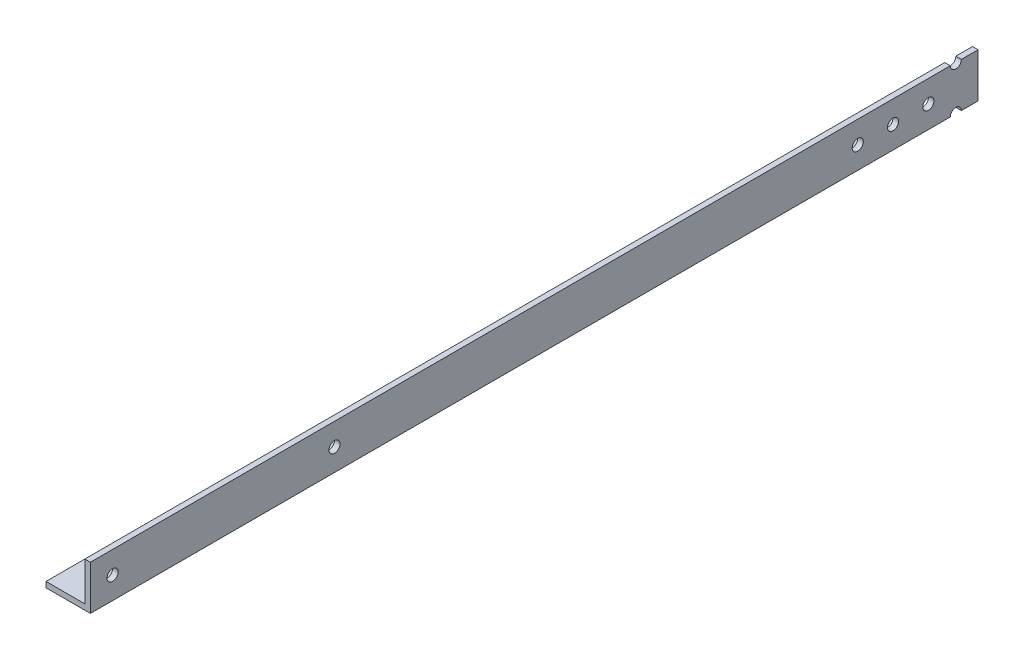
ISO-10303-21;
HEADER;
FILE_DESCRIPTION(('STEP AP214'),'2;1');
FILE_NAME('part.step','',(''),(''),'','','');
FILE_SCHEMA(('AUTOMOTIVE_DESIGN { 1 0 10303 214 1 1 1 1 }'));
ENDSEC;
DATA;
#1=APPLICATION_CONTEXT('core data for automotive mechanical design processes');
#2=APPLICATION_PROTOCOL_DEFINITION('international standard','automotive_design',2000,#1);
#3=PRODUCT_CONTEXT('',#1,'mechanical');
#4=PRODUCT('Part','Part','',(#3));
#5=PRODUCT_RELATED_PRODUCT_CATEGORY('part','',(#4));
#6=PRODUCT_DEFINITION_FORMATION('','',#4);
#7=PRODUCT_DEFINITION_CONTEXT('part definition',#1,'design');
#8=PRODUCT_DEFINITION('design','',#6,#7);
#9=PRODUCT_DEFINITION_SHAPE('','',#8);
#10=(LENGTH_UNIT() NAMED_UNIT(*) SI_UNIT(.MILLI.,.METRE.));
#11=(NAMED_UNIT(*) PLANE_ANGLE_UNIT() SI_UNIT($,.RADIAN.));
#12=(NAMED_UNIT(*) SI_UNIT($,.STERADIAN.) SOLID_ANGLE_UNIT());
#13=UNCERTAINTY_MEASURE_WITH_UNIT(LENGTH_MEASURE(1.E-05),#10,'distance_accuracy_value','');
#14=(GEOMETRIC_REPRESENTATION_CONTEXT(3) GLOBAL_UNCERTAINTY_ASSIGNED_CONTEXT((#13)) GLOBAL_UNIT_ASSIGNED_CONTEXT((#10,
#11,#12)) REPRESENTATION_CONTEXT('',''));
#15=CARTESIAN_POINT('',(0.,0.,0.));
#16=DIRECTION('',(0.,0.,1.));
#17=DIRECTION('',(1.,0.,0.));
#18=AXIS2_PLACEMENT_3D('',#15,#16,#17);
#19=CARTESIAN_POINT('',(-12.7,0.,254.));
#20=DIRECTION('',(0.,1.,0.));
#21=DIRECTION('',(0.,0.,1.));
#22=AXIS2_PLACEMENT_3D('',#19,#20,#21);
#23=PLANE('',#22);
#24=DIRECTION('',(0.,0.,1.));
#25=VECTOR('',#24,1.);
#26=CARTESIAN_POINT('',(-1.5875,0.,0.));
#27=LINE('',#26,#25);
#28=CARTESIAN_POINT('',(-1.5875,0.,7.93749999999999));
#29=VERTEX_POINT('',#28);
#30=CARTESIAN_POINT('',(-1.5875,0.,12.7));
#31=VERTEX_POINT('',#30);
#32=EDGE_CURVE('E130',#29,#31,#27,.T.);
#33=ORIENTED_EDGE('',*,*,#32,.F.);
#34=DIRECTION('',(1.,0.,0.));
#35=VECTOR('',#34,1.);
#36=CARTESIAN_POINT('',(-6.07762806053458,0.,7.93749999999999));
#37=LINE('',#36,#35);
#38=CARTESIAN_POINT('',(0.,0.,7.93749999999999));
#39=VERTEX_POINT('',#38);
#40=EDGE_CURVE('E46',#29,#39,#37,.T.);
#41=ORIENTED_EDGE('',*,*,#40,.T.);
#42=DIRECTION('',(0.,0.,-1.));
#43=VECTOR('',#42,1.);
#44=CARTESIAN_POINT('',(0.,0.,254.));
#45=LINE('',#44,#43);
#46=CARTESIAN_POINT('',(0.,0.,254.));
#47=VERTEX_POINT('',#46);
#48=EDGE_CURVE('E39',#47,#39,#45,.T.);
#49=ORIENTED_EDGE('',*,*,#48,.F.);
#50=DIRECTION('',(1.,0.,0.));
#51=VECTOR('',#50,1.);
#52=CARTESIAN_POINT('',(-12.7,0.,254.));
#53=LINE('',#52,#51);
#54=CARTESIAN_POINT('',(-12.7,0.,254.));
#55=VERTEX_POINT('',#54);
#56=EDGE_CURVE('E164',#55,#47,#53,.T.);
#57=ORIENTED_EDGE('',*,*,#56,.F.);
#58=DIRECTION('',(0.,0.,-1.));
#59=VECTOR('',#58,1.);
#60=CARTESIAN_POINT('',(-12.7,0.,254.));
#61=LINE('',#60,#59);
#62=CARTESIAN_POINT('',(-12.7,0.,12.7));
#63=VERTEX_POINT('',#62);
#64=EDGE_CURVE('E177',#55,#63,#61,.T.);
#65=ORIENTED_EDGE('',*,*,#64,.T.);
#66=DIRECTION('',(-1.,0.,0.));
#67=VECTOR('',#66,1.);
#68=CARTESIAN_POINT('',(-12.7,0.,12.7));
#69=LINE('',#68,#67);
#70=EDGE_CURVE('E129',#31,#63,#69,.T.);
#71=ORIENTED_EDGE('',*,*,#70,.F.);
#72=EDGE_LOOP('',(#33,#41,#49,#57,#65,#71));
#73=FACE_BOUND('',#72,.T.);
#74=ADVANCED_FACE('F31',(#73),#23,.F.);
#75=CARTESIAN_POINT('',(0.,12.7,254.));
#76=DIRECTION('',(0.,-1.,0.));
#77=DIRECTION('',(0.,0.,-1.));
#78=AXIS2_PLACEMENT_3D('',#75,#76,#77);
#79=PLANE('',#78);
#80=DIRECTION('',(0.,0.,-1.));
#81=VECTOR('',#80,1.);
#82=CARTESIAN_POINT('',(-1.5875,12.7,254.));
#83=LINE('',#82,#81);
#84=CARTESIAN_POINT('',(-1.5875,12.7,4.76249999999999));
#85=VERTEX_POINT('',#84);
#86=CARTESIAN_POINT('',(-1.5875,12.7,0.));
#87=VERTEX_POINT('',#86);
#88=EDGE_CURVE('E194',#85,#87,#83,.T.);
#89=ORIENTED_EDGE('',*,*,#88,.F.);
#90=DIRECTION('',(1.,0.,0.));
#91=VECTOR('',#90,1.);
#92=CARTESIAN_POINT('',(-6.07762806053458,12.7,4.76249999999999));
#93=LINE('',#92,#91);
#94=CARTESIAN_POINT('',(0.,12.7,4.76249999999999));
#95=VERTEX_POINT('',#94);
#96=EDGE_CURVE('E53',#85,#95,#93,.T.);
#97=ORIENTED_EDGE('',*,*,#96,.T.);
#98=DIRECTION('',(0.,0.,-1.));
#99=VECTOR('',#98,1.);
#100=CARTESIAN_POINT('',(0.,12.7,254.));
#101=LINE('',#100,#99);
#102=CARTESIAN_POINT('',(0.,12.7,0.));
#103=VERTEX_POINT('',#102);
#104=EDGE_CURVE('E198',#95,#103,#101,.T.);
#105=ORIENTED_EDGE('',*,*,#104,.T.);
#106=DIRECTION('',(-1.,0.,0.));
#107=VECTOR('',#106,1.);
#108=CARTESIAN_POINT('',(0.,12.7,0.));
#109=LINE('',#108,#107);
#110=EDGE_CURVE('E182',#103,#87,#109,.T.);
#111=ORIENTED_EDGE('',*,*,#110,.T.);
#112=EDGE_LOOP('',(#89,#97,#105,#111));
#113=FACE_BOUND('',#112,.T.);
#114=ADVANCED_FACE('F227',(#113),#79,.F.);
#115=CARTESIAN_POINT('',(0.,0.,4.76249999999999));
#116=VERTEX_POINT('',#115);
#117=CARTESIAN_POINT('',(0.,0.,0.));
#118=VERTEX_POINT('',#117);
#119=EDGE_CURVE('E123',#116,#118,#45,.T.);
#120=ORIENTED_EDGE('',*,*,#119,.F.);
#121=DIRECTION('',(1.,0.,0.));
#122=VECTOR('',#121,1.);
#123=CARTESIAN_POINT('',(-6.07762806053458,0.,4.76249999999999));
#124=LINE('',#123,#122);
#125=CARTESIAN_POINT('',(-1.5875,0.,4.76249999999999));
#126=VERTEX_POINT('',#125);
#127=EDGE_CURVE('E112',#116,#126,#124,.F.);
#128=ORIENTED_EDGE('',*,*,#127,.T.);
#129=CARTESIAN_POINT('',(-1.5875,0.,0.));
#130=VERTEX_POINT('',#129);
#131=EDGE_CURVE('E121',#130,#126,#27,.T.);
#132=ORIENTED_EDGE('',*,*,#131,.F.);
#133=DIRECTION('',(1.,0.,0.));
#134=VECTOR('',#133,1.);
#135=CARTESIAN_POINT('',(-12.7,0.,0.));
#136=LINE('',#135,#134);
#137=EDGE_CURVE('E163',#130,#118,#136,.T.);
#138=ORIENTED_EDGE('',*,*,#137,.T.);
#139=EDGE_LOOP('',(#120,#128,#132,#138));
#140=FACE_BOUND('',#139,.T.);
#141=ADVANCED_FACE('F33',(#140),#23,.F.);
#142=CARTESIAN_POINT('',(0.,0.,254.));
#143=DIRECTION('',(-1.,0.,0.));
#144=DIRECTION('',(0.,0.,1.));
#145=AXIS2_PLACEMENT_3D('',#142,#143,#144);
#146=PLANE('',#145);
#147=CARTESIAN_POINT('',(0.,6.35,34.4133003783411));
#148=DIRECTION('',(1.,0.,0.));
#149=DIRECTION('',(0.,0.,-1.));
#150=AXIS2_PLACEMENT_3D('',#147,#148,#149);
#151=CIRCLE('',#150,1.5875);
#152=CARTESIAN_POINT('',(0.,6.35,32.8258003783411));
#153=VERTEX_POINT('',#152);
#154=EDGE_CURVE('E327',#153,#153,#151,.T.);
#155=ORIENTED_EDGE('',*,*,#154,.F.);
#156=EDGE_LOOP('',(#155));
#157=FACE_BOUND('',#156,.T.);
#158=CARTESIAN_POINT('',(0.,6.35,24.3105122421383));
#159=DIRECTION('',(1.,0.,0.));
#160=DIRECTION('',(0.,0.,-1.));
#161=AXIS2_PLACEMENT_3D('',#158,#159,#160);
#162=CIRCLE('',#161,1.5875);
#163=CARTESIAN_POINT('',(0.,6.35,22.7230122421383));
#164=VERTEX_POINT('',#163);
#165=EDGE_CURVE('E132',#164,#164,#162,.T.);
#166=ORIENTED_EDGE('',*,*,#165,.F.);
#167=EDGE_LOOP('',(#166));
#168=FACE_BOUND('',#167,.T.);
#169=CARTESIAN_POINT('',(0.,6.35,14.2077241059355));
#170=DIRECTION('',(1.,0.,0.));
#171=DIRECTION('',(0.,0.,-1.));
#172=AXIS2_PLACEMENT_3D('',#169,#170,#171);
#173=CIRCLE('',#172,1.5875);
#174=CARTESIAN_POINT('',(0.,6.35,12.6202241059355));
#175=VERTEX_POINT('',#174);
#176=EDGE_CURVE('E147',#175,#175,#173,.T.);
#177=ORIENTED_EDGE('',*,*,#176,.F.);
#178=EDGE_LOOP('',(#177));
#179=FACE_BOUND('',#178,.T.);
#180=CARTESIAN_POINT('',(0.,6.35,184.15));
#181=DIRECTION('',(1.,0.,0.));
#182=DIRECTION('',(0.,0.,-1.));
#183=AXIS2_PLACEMENT_3D('',#180,#181,#182);
#184=CIRCLE('',#183,1.58750000000004);
#185=CARTESIAN_POINT('',(0.,6.35,182.5625));
#186=VERTEX_POINT('',#185);
#187=EDGE_CURVE('E151',#186,#186,#184,.T.);
#188=ORIENTED_EDGE('',*,*,#187,.F.);
#189=EDGE_LOOP('',(#188));
#190=FACE_BOUND('',#189,.T.);
#191=CARTESIAN_POINT('',(0.,6.35,247.65));
#192=DIRECTION('',(1.,0.,0.));
#193=DIRECTION('',(0.,0.,-1.));
#194=AXIS2_PLACEMENT_3D('',#191,#192,#193);
#195=CIRCLE('',#194,1.58750000000004);
#196=CARTESIAN_POINT('',(0.,6.35,246.0625));
#197=VERTEX_POINT('',#196);
#198=EDGE_CURVE('E157',#197,#197,#195,.T.);
#199=ORIENTED_EDGE('',*,*,#198,.F.);
#200=EDGE_LOOP('',(#199));
#201=FACE_BOUND('',#200,.T.);
#202=ORIENTED_EDGE('',*,*,#48,.T.);
#203=CARTESIAN_POINT('',(0.,0.,6.34999999999999));
#204=DIRECTION('',(1.,0.,0.));
#205=DIRECTION('',(0.,0.,-1.));
#206=AXIS2_PLACEMENT_3D('',#203,#204,#205);
#207=CIRCLE('',#206,1.5875);
#208=EDGE_CURVE('E124',#116,#39,#207,.T.);
#209=ORIENTED_EDGE('',*,*,#208,.F.);
#210=ORIENTED_EDGE('',*,*,#119,.T.);
#211=DIRECTION('',(0.,1.,0.));
#212=VECTOR('',#211,1.);
#213=CARTESIAN_POINT('',(0.,0.,0.));
#214=LINE('',#213,#212);
#215=EDGE_CURVE('E179',#118,#103,#214,.T.);
#216=ORIENTED_EDGE('',*,*,#215,.T.);
#217=ORIENTED_EDGE('',*,*,#104,.F.);
#218=CARTESIAN_POINT('',(0.,12.7,6.34999999999999));
#219=DIRECTION('',(1.,0.,0.));
#220=DIRECTION('',(0.,0.,-1.));
#221=AXIS2_PLACEMENT_3D('',#218,#219,#220);
#222=CIRCLE('',#221,1.5875);
#223=CARTESIAN_POINT('',(0.,12.7,7.93749999999999));
#224=VERTEX_POINT('',#223);
#225=EDGE_CURVE('E286',#224,#95,#222,.T.);
#226=ORIENTED_EDGE('',*,*,#225,.F.);
#227=CARTESIAN_POINT('',(0.,12.7,254.));
#228=VERTEX_POINT('',#227);
#229=EDGE_CURVE('E199',#228,#224,#101,.T.);
#230=ORIENTED_EDGE('',*,*,#229,.F.);
#231=DIRECTION('',(0.,1.,0.));
#232=VECTOR('',#231,1.);
#233=CARTESIAN_POINT('',(0.,0.,254.));
#234=LINE('',#233,#232);
#235=EDGE_CURVE('E167',#47,#228,#234,.T.);
#236=ORIENTED_EDGE('',*,*,#235,.F.);
#237=EDGE_LOOP('',(#202,#209,#210,#216,#217,#226,#230,#236));
#238=FACE_BOUND('',#237,.T.);
#239=ADVANCED_FACE('F236',(#157,#168,#179,#190,#201,#238),#146,.F.);
#240=ORIENTED_EDGE('',*,*,#229,.T.);
#241=DIRECTION('',(1.,0.,0.));
#242=VECTOR('',#241,1.);
#243=CARTESIAN_POINT('',(-6.07762806053458,12.7,7.93749999999999));
#244=LINE('',#243,#242);
#245=CARTESIAN_POINT('',(-1.5875,12.7,7.93749999999999));
#246=VERTEX_POINT('',#245);
#247=EDGE_CURVE('E292',#224,#246,#244,.F.);
#248=ORIENTED_EDGE('',*,*,#247,.T.);
#249=CARTESIAN_POINT('',(-1.5875,12.7,254.));
#250=VERTEX_POINT('',#249);
#251=EDGE_CURVE('E195',#250,#246,#83,.T.);
#252=ORIENTED_EDGE('',*,*,#251,.F.);
#253=DIRECTION('',(-1.,0.,0.));
#254=VECTOR('',#253,1.);
#255=CARTESIAN_POINT('',(0.,12.7,254.));
#256=LINE('',#255,#254);
#257=EDGE_CURVE('E169',#228,#250,#256,.T.);
#258=ORIENTED_EDGE('',*,*,#257,.F.);
#259=EDGE_LOOP('',(#240,#248,#252,#258));
#260=FACE_BOUND('',#259,.T.);
#261=ADVANCED_FACE('F234',(#260),#79,.F.);
#262=CARTESIAN_POINT('',(-1.5875,12.7,254.));
#263=DIRECTION('',(1.,0.,0.));
#264=DIRECTION('',(0.,1.,0.));
#265=AXIS2_PLACEMENT_3D('',#262,#263,#264);
#266=PLANE('',#265);
#267=CARTESIAN_POINT('',(-1.5875,6.35,34.4133003783411));
#268=DIRECTION('',(1.,0.,0.));
#269=DIRECTION('',(0.,1.,0.));
#270=AXIS2_PLACEMENT_3D('',#267,#268,#269);
#271=CIRCLE('',#270,1.5875);
#272=CARTESIAN_POINT('',(-1.5875,6.35,32.8258003783411));
#273=VERTEX_POINT('',#272);
#274=EDGE_CURVE('E325',#273,#273,#271,.F.);
#275=ORIENTED_EDGE('',*,*,#274,.F.);
#276=EDGE_LOOP('',(#275));
#277=FACE_BOUND('',#276,.T.);
#278=CARTESIAN_POINT('',(-1.5875,6.35,24.3105122421383));
#279=DIRECTION('',(1.,0.,0.));
#280=DIRECTION('',(0.,1.,0.));
#281=AXIS2_PLACEMENT_3D('',#278,#279,#280);
#282=CIRCLE('',#281,1.5875);
#283=CARTESIAN_POINT('',(-1.5875,7.9375,24.3105122421383));
#284=VERTEX_POINT('',#283);
#285=EDGE_CURVE('E146',#284,#284,#282,.T.);
#286=ORIENTED_EDGE('',*,*,#285,.T.);
#287=EDGE_LOOP('',(#286));
#288=FACE_BOUND('',#287,.T.);
#289=CARTESIAN_POINT('',(-1.5875,6.35,14.2077241059355));
#290=DIRECTION('',(1.,0.,0.));
#291=DIRECTION('',(0.,1.,0.));
#292=AXIS2_PLACEMENT_3D('',#289,#290,#291);
#293=CIRCLE('',#292,1.5875);
#294=CARTESIAN_POINT('',(-1.5875,7.9375,14.2077241059355));
#295=VERTEX_POINT('',#294);
#296=EDGE_CURVE('E150',#295,#295,#293,.T.);
#297=ORIENTED_EDGE('',*,*,#296,.T.);
#298=EDGE_LOOP('',(#297));
#299=FACE_BOUND('',#298,.T.);
#300=CARTESIAN_POINT('',(-1.5875,6.35,184.15));
#301=DIRECTION('',(1.,0.,0.));
#302=DIRECTION('',(0.,1.,0.));
#303=AXIS2_PLACEMENT_3D('',#300,#301,#302);
#304=CIRCLE('',#303,1.58750000000004);
#305=CARTESIAN_POINT('',(-1.5875,6.35,182.5625));
#306=VERTEX_POINT('',#305);
#307=EDGE_CURVE('E154',#306,#306,#304,.F.);
#308=ORIENTED_EDGE('',*,*,#307,.F.);
#309=EDGE_LOOP('',(#308));
#310=FACE_BOUND('',#309,.T.);
#311=CARTESIAN_POINT('',(-1.5875,6.35,247.65));
#312=DIRECTION('',(1.,0.,0.));
#313=DIRECTION('',(0.,1.,0.));
#314=AXIS2_PLACEMENT_3D('',#311,#312,#313);
#315=CIRCLE('',#314,1.58750000000004);
#316=CARTESIAN_POINT('',(-1.5875,6.35,246.0625));
#317=VERTEX_POINT('',#316);
#318=EDGE_CURVE('E160',#317,#317,#315,.F.);
#319=ORIENTED_EDGE('',*,*,#318,.F.);
#320=EDGE_LOOP('',(#319));
#321=FACE_BOUND('',#320,.T.);
#322=ORIENTED_EDGE('',*,*,#131,.T.);
#323=CARTESIAN_POINT('',(-1.5875,0.,6.34999999999999));
#324=DIRECTION('',(1.,0.,0.));
#325=DIRECTION('',(0.,1.,0.));
#326=AXIS2_PLACEMENT_3D('',#323,#324,#325);
#327=CIRCLE('',#326,1.5875);
#328=EDGE_CURVE('E11',#126,#29,#327,.T.);
#329=ORIENTED_EDGE('',*,*,#328,.T.);
#330=ORIENTED_EDGE('',*,*,#32,.T.);
#331=DIRECTION('',(0.,1.,0.));
#332=VECTOR('',#331,1.);
#333=CARTESIAN_POINT('',(-1.5875,-16.8753564777163,12.7));
#334=LINE('',#333,#332);
#335=CARTESIAN_POINT('',(-1.5875,1.5875,12.7));
#336=VERTEX_POINT('',#335);
#337=EDGE_CURVE('E134',#31,#336,#334,.T.);
#338=ORIENTED_EDGE('',*,*,#337,.T.);
#339=DIRECTION('',(0.,0.,-1.));
#340=VECTOR('',#339,1.);
#341=CARTESIAN_POINT('',(-1.5875,1.5875,254.));
#342=LINE('',#341,#340);
#343=CARTESIAN_POINT('',(-1.5875,1.5875,254.));
#344=VERTEX_POINT('',#343);
#345=EDGE_CURVE('E191',#344,#336,#342,.T.);
#346=ORIENTED_EDGE('',*,*,#345,.F.);
#347=DIRECTION('',(0.,-1.,0.));
#348=VECTOR('',#347,1.);
#349=CARTESIAN_POINT('',(-1.5875,12.7,254.));
#350=LINE('',#349,#348);
#351=EDGE_CURVE('E171',#250,#344,#350,.T.);
#352=ORIENTED_EDGE('',*,*,#351,.F.);
#353=ORIENTED_EDGE('',*,*,#251,.T.);
#354=CARTESIAN_POINT('',(-1.5875,12.7,6.34999999999999));
#355=DIRECTION('',(1.,0.,0.));
#356=DIRECTION('',(0.,1.,0.));
#357=AXIS2_PLACEMENT_3D('',#354,#355,#356);
#358=CIRCLE('',#357,1.5875);
#359=EDGE_CURVE('E288',#85,#246,#358,.F.);
#360=ORIENTED_EDGE('',*,*,#359,.F.);
#361=ORIENTED_EDGE('',*,*,#88,.T.);
#362=DIRECTION('',(0.,-1.,0.));
#363=VECTOR('',#362,1.);
#364=CARTESIAN_POINT('',(-1.5875,12.7,0.));
#365=LINE('',#364,#363);
#366=EDGE_CURVE('E128',#87,#130,#365,.T.);
#367=ORIENTED_EDGE('',*,*,#366,.T.);
#368=EDGE_LOOP('',(#322,#329,#330,#338,#346,#352,#353,#360,#361,#367));
#369=FACE_BOUND('',#368,.T.);
#370=ADVANCED_FACE('F126',(#277,#288,#299,#310,#321,#369),#266,.F.);
#371=CARTESIAN_POINT('',(-1.5875,1.5875,254.));
#372=DIRECTION('',(0.,-1.,0.));
#373=DIRECTION('',(1.,0.,0.));
#374=AXIS2_PLACEMENT_3D('',#371,#372,#373);
#375=PLANE('',#374);
#376=ORIENTED_EDGE('',*,*,#345,.T.);
#377=DIRECTION('',(1.,0.,0.));
#378=VECTOR('',#377,1.);
#379=CARTESIAN_POINT('',(-12.7,1.5875,12.7));
#380=LINE('',#379,#378);
#381=CARTESIAN_POINT('',(-12.7,1.5875,12.7));
#382=VERTEX_POINT('',#381);
#383=EDGE_CURVE('E138',#382,#336,#380,.T.);
#384=ORIENTED_EDGE('',*,*,#383,.F.);
#385=DIRECTION('',(0.,0.,-1.));
#386=VECTOR('',#385,1.);
#387=CARTESIAN_POINT('',(-12.7,1.5875,254.));
#388=LINE('',#387,#386);
#389=CARTESIAN_POINT('',(-12.7,1.5875,254.));
#390=VERTEX_POINT('',#389);
#391=EDGE_CURVE('E188',#390,#382,#388,.T.);
#392=ORIENTED_EDGE('',*,*,#391,.F.);
#393=DIRECTION('',(-1.,0.,0.));
#394=VECTOR('',#393,1.);
#395=CARTESIAN_POINT('',(-1.5875,1.5875,254.));
#396=LINE('',#395,#394);
#397=EDGE_CURVE('E173',#344,#390,#396,.T.);
#398=ORIENTED_EDGE('',*,*,#397,.F.);
#399=EDGE_LOOP('',(#376,#384,#392,#398));
#400=FACE_BOUND('',#399,.T.);
#401=ADVANCED_FACE('F250',(#400),#375,.F.);
#402=CARTESIAN_POINT('',(-12.7,1.5875,254.));
#403=DIRECTION('',(1.,0.,0.));
#404=DIRECTION('',(0.,0.,-1.));
#405=AXIS2_PLACEMENT_3D('',#402,#403,#404);
#406=PLANE('',#405);
#407=ORIENTED_EDGE('',*,*,#391,.T.);
#408=DIRECTION('',(0.,1.,0.));
#409=VECTOR('',#408,1.);
#410=CARTESIAN_POINT('',(-12.7,-16.8753564777163,12.7));
#411=LINE('',#410,#409);
#412=EDGE_CURVE('E141',#63,#382,#411,.T.);
#413=ORIENTED_EDGE('',*,*,#412,.F.);
#414=ORIENTED_EDGE('',*,*,#64,.F.);
#415=DIRECTION('',(0.,-1.,0.));
#416=VECTOR('',#415,1.);
#417=CARTESIAN_POINT('',(-12.7,1.5875,254.));
#418=LINE('',#417,#416);
#419=EDGE_CURVE('E175',#390,#55,#418,.T.);
#420=ORIENTED_EDGE('',*,*,#419,.F.);
#421=EDGE_LOOP('',(#407,#413,#414,#420));
#422=FACE_BOUND('',#421,.T.);
#423=ADVANCED_FACE('F254',(#422),#406,.F.);
#424=CARTESIAN_POINT('',(0.,0.,254.));
#425=DIRECTION('',(0.,0.,1.));
#426=DIRECTION('',(1.,0.,0.));
#427=AXIS2_PLACEMENT_3D('',#424,#425,#426);
#428=PLANE('',#427);
#429=ORIENTED_EDGE('',*,*,#56,.T.);
#430=ORIENTED_EDGE('',*,*,#235,.T.);
#431=ORIENTED_EDGE('',*,*,#257,.T.);
#432=ORIENTED_EDGE('',*,*,#351,.T.);
#433=ORIENTED_EDGE('',*,*,#397,.T.);
#434=ORIENTED_EDGE('',*,*,#419,.T.);
#435=EDGE_LOOP('',(#429,#430,#431,#432,#433,#434));
#436=FACE_BOUND('',#435,.T.);
#437=ADVANCED_FACE('F258',(#436),#428,.T.);
#438=CARTESIAN_POINT('',(0.,0.,0.));
#439=DIRECTION('',(0.,0.,1.));
#440=DIRECTION('',(1.,0.,0.));
#441=AXIS2_PLACEMENT_3D('',#438,#439,#440);
#442=PLANE('',#441);
#443=ORIENTED_EDGE('',*,*,#137,.F.);
#444=ORIENTED_EDGE('',*,*,#366,.F.);
#445=ORIENTED_EDGE('',*,*,#110,.F.);
#446=ORIENTED_EDGE('',*,*,#215,.F.);
#447=EDGE_LOOP('',(#443,#444,#445,#446));
#448=FACE_BOUND('',#447,.T.);
#449=ADVANCED_FACE('F260',(#448),#442,.F.);
#450=CARTESIAN_POINT('',(-6.0776280605347,6.35,247.65));
#451=DIRECTION('',(1.,0.,0.));
#452=DIRECTION('',(0.,0.,-1.));
#453=AXIS2_PLACEMENT_3D('',#450,#451,#452);
#454=CYLINDRICAL_SURFACE('',#453,1.58750000000004);
#455=CARTESIAN_POINT('',(-1.5875,6.35,246.0625));
#456=CARTESIAN_POINT('',(-1.57096354166667,6.35,246.0625));
#457=CARTESIAN_POINT('',(-1.55442708333333,6.35,246.0625));
#458=CARTESIAN_POINT('',(-1.52135416666667,6.35,246.0625));
#459=CARTESIAN_POINT('',(-1.50481770833333,6.35,246.0625));
#460=CARTESIAN_POINT('',(-1.47174479166667,6.35,246.0625));
#461=CARTESIAN_POINT('',(-1.45520833333333,6.35,246.0625));
#462=CARTESIAN_POINT('',(-1.42213541666667,6.35,246.0625));
#463=CARTESIAN_POINT('',(-1.40559895833333,6.35,246.0625));
#464=CARTESIAN_POINT('',(-1.37252604166667,6.35,246.0625));
#465=CARTESIAN_POINT('',(-1.35598958333333,6.35,246.0625));
#466=CARTESIAN_POINT('',(-1.32291666666667,6.35,246.0625));
#467=CARTESIAN_POINT('',(-1.30638020833333,6.35,246.0625));
#468=CARTESIAN_POINT('',(-1.27330729166667,6.35,246.0625));
#469=CARTESIAN_POINT('',(-1.25677083333333,6.35,246.0625));
#470=CARTESIAN_POINT('',(-1.22369791666667,6.35,246.0625));
#471=CARTESIAN_POINT('',(-1.20716145833333,6.35,246.0625));
#472=CARTESIAN_POINT('',(-1.17408854166667,6.35,246.0625));
#473=CARTESIAN_POINT('',(-1.15755208333333,6.35,246.0625));
#474=CARTESIAN_POINT('',(-1.12447916666667,6.35,246.0625));
#475=CARTESIAN_POINT('',(-1.10794270833333,6.35,246.0625));
#476=CARTESIAN_POINT('',(-1.07486979166667,6.35,246.0625));
#477=CARTESIAN_POINT('',(-1.05833333333333,6.35,246.0625));
#478=CARTESIAN_POINT('',(-1.02526041666667,6.35,246.0625));
#479=CARTESIAN_POINT('',(-1.00872395833333,6.35,246.0625));
#480=CARTESIAN_POINT('',(-0.975651041666666,6.35,246.0625));
#481=CARTESIAN_POINT('',(-0.959114583333333,6.35,246.0625));
#482=CARTESIAN_POINT('',(-0.926041666666666,6.35,246.0625));
#483=CARTESIAN_POINT('',(-0.909505208333332,6.35,246.0625));
#484=CARTESIAN_POINT('',(-0.876432291666666,6.35,246.0625));
#485=CARTESIAN_POINT('',(-0.859895833333332,6.35,246.0625));
#486=CARTESIAN_POINT('',(-0.826822916666666,6.35,246.0625));
#487=CARTESIAN_POINT('',(-0.810286458333333,6.35,246.0625));
#488=CARTESIAN_POINT('',(-0.777213541666666,6.35,246.0625));
#489=CARTESIAN_POINT('',(-0.760677083333333,6.35,246.0625));
#490=CARTESIAN_POINT('',(-0.727604166666666,6.35,246.0625));
#491=CARTESIAN_POINT('',(-0.711067708333333,6.35,246.0625));
#492=CARTESIAN_POINT('',(-0.677994791666666,6.35,246.0625));
#493=CARTESIAN_POINT('',(-0.661458333333333,6.35,246.0625));
#494=CARTESIAN_POINT('',(-0.628385416666666,6.35,246.0625));
#495=CARTESIAN_POINT('',(-0.611848958333333,6.35,246.0625));
#496=CARTESIAN_POINT('',(-0.578776041666666,6.35,246.0625));
#497=CARTESIAN_POINT('',(-0.562239583333333,6.35,246.0625));
#498=CARTESIAN_POINT('',(-0.529166666666666,6.35,246.0625));
#499=CARTESIAN_POINT('',(-0.512630208333333,6.35,246.0625));
#500=CARTESIAN_POINT('',(-0.479557291666666,6.35,246.0625));
#501=CARTESIAN_POINT('',(-0.463020833333333,6.35,246.0625));
#502=CARTESIAN_POINT('',(-0.429947916666666,6.35,246.0625));
#503=CARTESIAN_POINT('',(-0.413411458333333,6.35,246.0625));
#504=CARTESIAN_POINT('',(-0.380338541666666,6.35,246.0625));
#505=CARTESIAN_POINT('',(-0.363802083333333,6.35,246.0625));
#506=CARTESIAN_POINT('',(-0.330729166666667,6.35,246.0625));
#507=CARTESIAN_POINT('',(-0.314192708333333,6.35,246.0625));
#508=CARTESIAN_POINT('',(-0.281119791666667,6.35,246.0625));
#509=CARTESIAN_POINT('',(-0.264583333333333,6.35,246.0625));
#510=CARTESIAN_POINT('',(-0.231510416666666,6.35,246.0625));
#511=CARTESIAN_POINT('',(-0.214973958333333,6.35,246.0625));
#512=CARTESIAN_POINT('',(-0.181901041666667,6.35,246.0625));
#513=CARTESIAN_POINT('',(-0.165364583333333,6.35,246.0625));
#514=CARTESIAN_POINT('',(-0.132291666666667,6.35,246.0625));
#515=CARTESIAN_POINT('',(-0.115755208333333,6.35,246.0625));
#516=CARTESIAN_POINT('',(-0.0826822916666662,6.35,246.0625));
#517=CARTESIAN_POINT('',(-0.066145833333333,6.35,246.0625));
#518=CARTESIAN_POINT('',(-0.0330729166666665,6.35,246.0625));
#519=CARTESIAN_POINT('',(-0.0165364583333332,6.35,246.0625));
#520=CARTESIAN_POINT('',(0.,6.35,246.0625));
#521=B_SPLINE_CURVE_WITH_KNOTS('',3,(#455,#456,#457,#458,#459,#460,#461,#462,#463,#464,#465,
#466,#467,#468,#469,#470,#471,#472,#473,#474,#475,#476,#477,#478,#479,#480,#481,#482,#483,#484,
#485,#486,#487,#488,#489,#490,#491,#492,#493,#494,#495,#496,#497,#498,#499,#500,#501,#502,#503,
#504,#505,#506,#507,#508,#509,#510,#511,#512,#513,#514,#515,#516,#517,#518,#519,#520),
.UNSPECIFIED.,.F.,.F.,(4,2,2,2,2,2,2,2,2,2,2,2,2,2,2,2,2,2,2,2,2,2,2,2,2,2,2,2,2,2,2,2,4),(0.,
0.0496093749999997,0.0992187499999995,0.148828125,0.1984375,0.248046875,0.29765625,0.347265625,
0.396875,0.446484374999999,0.496093749999999,0.545703125,0.595312499999999,0.644921874999999,
0.69453125,0.744140625,0.793749999999999,0.843359374999999,0.892968749999999,0.942578124999999,
0.992187499999999,1.041796875,1.09140625,1.141015625,1.190625,1.240234375,1.28984375,
1.339453125,1.3890625,1.438671875,1.48828125,1.537890625,1.5875),.UNSPECIFIED.);
#522=EDGE_CURVE('BSEAM263',#317,#197,#521,.T.);
#523=ORIENTED_EDGE('',*,*,#318,.T.);
#524=ORIENTED_EDGE('',*,*,#198,.T.);
#525=ORIENTED_EDGE('',*,*,#522,.T.);
#526=ORIENTED_EDGE('',*,*,#522,.F.);
#527=EDGE_LOOP('',(#523,#525,#524,#526));
#528=FACE_BOUND('',#527,.T.);
#529=ADVANCED_FACE('F263',(#528),#454,.F.);
#530=CARTESIAN_POINT('',(-6.0776280605347,6.35,184.15));
#531=DIRECTION('',(1.,0.,0.));
#532=DIRECTION('',(0.,0.,-1.));
#533=AXIS2_PLACEMENT_3D('',#530,#531,#532);
#534=CYLINDRICAL_SURFACE('',#533,1.58750000000004);
#535=CARTESIAN_POINT('',(-1.5875,6.35,182.5625));
#536=CARTESIAN_POINT('',(-1.57096354166667,6.35,182.5625));
#537=CARTESIAN_POINT('',(-1.55442708333333,6.35,182.5625));
#538=CARTESIAN_POINT('',(-1.52135416666667,6.35,182.5625));
#539=CARTESIAN_POINT('',(-1.50481770833333,6.35,182.5625));
#540=CARTESIAN_POINT('',(-1.47174479166667,6.35,182.5625));
#541=CARTESIAN_POINT('',(-1.45520833333333,6.35,182.5625));
#542=CARTESIAN_POINT('',(-1.42213541666667,6.35,182.5625));
#543=CARTESIAN_POINT('',(-1.40559895833333,6.35,182.5625));
#544=CARTESIAN_POINT('',(-1.37252604166667,6.35,182.5625));
#545=CARTESIAN_POINT('',(-1.35598958333333,6.35,182.5625));
#546=CARTESIAN_POINT('',(-1.32291666666667,6.35,182.5625));
#547=CARTESIAN_POINT('',(-1.30638020833333,6.35,182.5625));
#548=CARTESIAN_POINT('',(-1.27330729166667,6.35,182.5625));
#549=CARTESIAN_POINT('',(-1.25677083333333,6.35,182.5625));
#550=CARTESIAN_POINT('',(-1.22369791666667,6.35,182.5625));
#551=CARTESIAN_POINT('',(-1.20716145833333,6.35,182.5625));
#552=CARTESIAN_POINT('',(-1.17408854166667,6.35,182.5625));
#553=CARTESIAN_POINT('',(-1.15755208333333,6.35,182.5625));
#554=CARTESIAN_POINT('',(-1.12447916666667,6.35,182.5625));
#555=CARTESIAN_POINT('',(-1.10794270833333,6.35,182.5625));
#556=CARTESIAN_POINT('',(-1.07486979166667,6.35,182.5625));
#557=CARTESIAN_POINT('',(-1.05833333333333,6.35,182.5625));
#558=CARTESIAN_POINT('',(-1.02526041666667,6.35,182.5625));
#559=CARTESIAN_POINT('',(-1.00872395833333,6.35,182.5625));
#560=CARTESIAN_POINT('',(-0.975651041666666,6.35,182.5625));
#561=CARTESIAN_POINT('',(-0.959114583333333,6.35,182.5625));
#562=CARTESIAN_POINT('',(-0.926041666666666,6.35,182.5625));
#563=CARTESIAN_POINT('',(-0.909505208333332,6.35,182.5625));
#564=CARTESIAN_POINT('',(-0.876432291666666,6.35,182.5625));
#565=CARTESIAN_POINT('',(-0.859895833333332,6.35,182.5625));
#566=CARTESIAN_POINT('',(-0.826822916666666,6.35,182.5625));
#567=CARTESIAN_POINT('',(-0.810286458333333,6.35,182.5625));
#568=CARTESIAN_POINT('',(-0.777213541666666,6.35,182.5625));
#569=CARTESIAN_POINT('',(-0.760677083333333,6.35,182.5625));
#570=CARTESIAN_POINT('',(-0.727604166666666,6.35,182.5625));
#571=CARTESIAN_POINT('',(-0.711067708333333,6.35,182.5625));
#572=CARTESIAN_POINT('',(-0.677994791666666,6.35,182.5625));
#573=CARTESIAN_POINT('',(-0.661458333333333,6.35,182.5625));
#574=CARTESIAN_POINT('',(-0.628385416666666,6.35,182.5625));
#575=CARTESIAN_POINT('',(-0.611848958333333,6.35,182.5625));
#576=CARTESIAN_POINT('',(-0.578776041666666,6.35,182.5625));
#577=CARTESIAN_POINT('',(-0.562239583333333,6.35,182.5625));
#578=CARTESIAN_POINT('',(-0.529166666666666,6.35,182.5625));
#579=CARTESIAN_POINT('',(-0.512630208333333,6.35,182.5625));
#580=CARTESIAN_POINT('',(-0.479557291666666,6.35,182.5625));
#581=CARTESIAN_POINT('',(-0.463020833333333,6.35,182.5625));
#582=CARTESIAN_POINT('',(-0.429947916666666,6.35,182.5625));
#583=CARTESIAN_POINT('',(-0.413411458333333,6.35,182.5625));
#584=CARTESIAN_POINT('',(-0.380338541666666,6.35,182.5625));
#585=CARTESIAN_POINT('',(-0.363802083333333,6.35,182.5625));
#586=CARTESIAN_POINT('',(-0.330729166666667,6.35,182.5625));
#587=CARTESIAN_POINT('',(-0.314192708333333,6.35,182.5625));
#588=CARTESIAN_POINT('',(-0.281119791666667,6.35,182.5625));
#589=CARTESIAN_POINT('',(-0.264583333333333,6.35,182.5625));
#590=CARTESIAN_POINT('',(-0.231510416666666,6.35,182.5625));
#591=CARTESIAN_POINT('',(-0.214973958333333,6.35,182.5625));
#592=CARTESIAN_POINT('',(-0.181901041666667,6.35,182.5625));
#593=CARTESIAN_POINT('',(-0.165364583333333,6.35,182.5625));
#594=CARTESIAN_POINT('',(-0.132291666666667,6.35,182.5625));
#595=CARTESIAN_POINT('',(-0.115755208333333,6.35,182.5625));
#596=CARTESIAN_POINT('',(-0.0826822916666662,6.35,182.5625));
#597=CARTESIAN_POINT('',(-0.066145833333333,6.35,182.5625));
#598=CARTESIAN_POINT('',(-0.0330729166666665,6.35,182.5625));
#599=CARTESIAN_POINT('',(-0.0165364583333332,6.35,182.5625));
#600=CARTESIAN_POINT('',(0.,6.35,182.5625));
#601=B_SPLINE_CURVE_WITH_KNOTS('',3,(#535,#536,#537,#538,#539,#540,#541,#542,#543,#544,#545,
#546,#547,#548,#549,#550,#551,#552,#553,#554,#555,#556,#557,#558,#559,#560,#561,#562,#563,#564,
#565,#566,#567,#568,#569,#570,#571,#572,#573,#574,#575,#576,#577,#578,#579,#580,#581,#582,#583,
#584,#585,#586,#587,#588,#589,#590,#591,#592,#593,#594,#595,#596,#597,#598,#599,#600),
.UNSPECIFIED.,.F.,.F.,(4,2,2,2,2,2,2,2,2,2,2,2,2,2,2,2,2,2,2,2,2,2,2,2,2,2,2,2,2,2,2,2,4),(0.,
0.0496093749999997,0.0992187499999995,0.148828125,0.1984375,0.248046875,0.29765625,0.347265625,
0.396875,0.446484374999999,0.496093749999999,0.545703125,0.595312499999999,0.644921874999999,
0.69453125,0.744140625,0.793749999999999,0.843359374999999,0.892968749999999,0.942578124999999,
0.992187499999999,1.041796875,1.09140625,1.141015625,1.190625,1.240234375,1.28984375,
1.339453125,1.3890625,1.438671875,1.48828125,1.537890625,1.5875),.UNSPECIFIED.);
#602=EDGE_CURVE('BSEAM223',#306,#186,#601,.T.);
#603=ORIENTED_EDGE('',*,*,#307,.T.);
#604=ORIENTED_EDGE('',*,*,#187,.T.);
#605=ORIENTED_EDGE('',*,*,#602,.T.);
#606=ORIENTED_EDGE('',*,*,#602,.F.);
#607=EDGE_LOOP('',(#603,#605,#604,#606));
#608=FACE_BOUND('',#607,.T.);
#609=ADVANCED_FACE('F223',(#608),#534,.F.);
#610=CARTESIAN_POINT('',(-12.7,6.35,14.2077241059355));
#611=DIRECTION('',(1.,0.,0.));
#612=DIRECTION('',(0.,0.,-1.));
#613=AXIS2_PLACEMENT_3D('',#610,#611,#612);
#614=CYLINDRICAL_SURFACE('',#613,1.5875);
#615=ORIENTED_EDGE('',*,*,#176,.T.);
#616=EDGE_LOOP('',(#615));
#617=FACE_BOUND('',#616,.T.);
#618=ORIENTED_EDGE('',*,*,#296,.F.);
#619=EDGE_LOOP('',(#618));
#620=FACE_BOUND('',#619,.T.);
#621=ADVANCED_FACE('F213',(#617,#620),#614,.F.);
#622=CARTESIAN_POINT('',(-12.7,6.35,24.3105122421383));
#623=DIRECTION('',(1.,0.,0.));
#624=DIRECTION('',(0.,0.,-1.));
#625=AXIS2_PLACEMENT_3D('',#622,#623,#624);
#626=CYLINDRICAL_SURFACE('',#625,1.5875);
#627=ORIENTED_EDGE('',*,*,#165,.T.);
#628=EDGE_LOOP('',(#627));
#629=FACE_BOUND('',#628,.T.);
#630=ORIENTED_EDGE('',*,*,#285,.F.);
#631=EDGE_LOOP('',(#630));
#632=FACE_BOUND('',#631,.T.);
#633=ADVANCED_FACE('F210',(#629,#632),#626,.F.);
#634=CARTESIAN_POINT('',(-12.7,-16.8753564777163,12.7));
#635=DIRECTION('',(0.,0.,1.));
#636=DIRECTION('',(1.,0.,0.));
#637=AXIS2_PLACEMENT_3D('',#634,#635,#636);
#638=PLANE('',#637);
#639=ORIENTED_EDGE('',*,*,#70,.T.);
#640=ORIENTED_EDGE('',*,*,#412,.T.);
#641=ORIENTED_EDGE('',*,*,#383,.T.);
#642=ORIENTED_EDGE('',*,*,#337,.F.);
#643=EDGE_LOOP('',(#639,#640,#641,#642));
#644=FACE_BOUND('',#643,.T.);
#645=ADVANCED_FACE('F212',(#644),#638,.F.);
#646=CARTESIAN_POINT('',(-6.07762806053458,12.7,6.34999999999999));
#647=DIRECTION('',(1.,0.,0.));
#648=DIRECTION('',(0.,0.,-1.));
#649=AXIS2_PLACEMENT_3D('',#646,#647,#648);
#650=CYLINDRICAL_SURFACE('',#649,1.5875);
#651=ORIENTED_EDGE('',*,*,#359,.T.);
#652=ORIENTED_EDGE('',*,*,#247,.F.);
#653=ORIENTED_EDGE('',*,*,#225,.T.);
#654=ORIENTED_EDGE('',*,*,#96,.F.);
#655=EDGE_LOOP('',(#651,#652,#653,#654));
#656=FACE_BOUND('',#655,.T.);
#657=ADVANCED_FACE('F220',(#656),#650,.F.);
#658=CARTESIAN_POINT('',(-6.07762806053458,0.,6.34999999999999));
#659=DIRECTION('',(1.,0.,0.));
#660=DIRECTION('',(0.,0.,-1.));
#661=AXIS2_PLACEMENT_3D('',#658,#659,#660);
#662=CYLINDRICAL_SURFACE('',#661,1.5875);
#663=ORIENTED_EDGE('',*,*,#328,.F.);
#664=ORIENTED_EDGE('',*,*,#127,.F.);
#665=ORIENTED_EDGE('',*,*,#208,.T.);
#666=ORIENTED_EDGE('',*,*,#40,.F.);
#667=EDGE_LOOP('',(#663,#664,#665,#666));
#668=FACE_BOUND('',#667,.T.);
#669=ADVANCED_FACE('F111',(#668),#662,.F.);
#670=CARTESIAN_POINT('',(-6.07762806053457,6.35,34.4133003783411));
#671=DIRECTION('',(1.,0.,0.));
#672=DIRECTION('',(0.,0.,-1.));
#673=AXIS2_PLACEMENT_3D('',#670,#671,#672);
#674=CYLINDRICAL_SURFACE('',#673,1.5875);
#675=CARTESIAN_POINT('',(-1.5875,6.35,32.8258003783411));
#676=CARTESIAN_POINT('',(-1.57096354166667,6.35,32.8258003783411));
#677=CARTESIAN_POINT('',(-1.55442708333333,6.35,32.8258003783411));
#678=CARTESIAN_POINT('',(-1.52135416666667,6.35,32.8258003783411));
#679=CARTESIAN_POINT('',(-1.50481770833333,6.35,32.8258003783411));
#680=CARTESIAN_POINT('',(-1.47174479166667,6.35,32.8258003783411));
#681=CARTESIAN_POINT('',(-1.45520833333333,6.35,32.8258003783411));
#682=CARTESIAN_POINT('',(-1.42213541666667,6.35,32.8258003783411));
#683=CARTESIAN_POINT('',(-1.40559895833333,6.35,32.8258003783411));
#684=CARTESIAN_POINT('',(-1.37252604166667,6.35,32.8258003783411));
#685=CARTESIAN_POINT('',(-1.35598958333333,6.35,32.8258003783411));
#686=CARTESIAN_POINT('',(-1.32291666666667,6.35,32.8258003783411));
#687=CARTESIAN_POINT('',(-1.30638020833333,6.35,32.8258003783411));
#688=CARTESIAN_POINT('',(-1.27330729166667,6.35,32.8258003783411));
#689=CARTESIAN_POINT('',(-1.25677083333333,6.35,32.8258003783411));
#690=CARTESIAN_POINT('',(-1.22369791666667,6.35,32.8258003783411));
#691=CARTESIAN_POINT('',(-1.20716145833333,6.35,32.8258003783411));
#692=CARTESIAN_POINT('',(-1.17408854166667,6.35,32.8258003783411));
#693=CARTESIAN_POINT('',(-1.15755208333333,6.35,32.8258003783411));
#694=CARTESIAN_POINT('',(-1.12447916666667,6.35,32.8258003783411));
#695=CARTESIAN_POINT('',(-1.10794270833333,6.35,32.8258003783411));
#696=CARTESIAN_POINT('',(-1.07486979166667,6.35,32.8258003783411));
#697=CARTESIAN_POINT('',(-1.05833333333333,6.35,32.8258003783411));
#698=CARTESIAN_POINT('',(-1.02526041666667,6.35,32.8258003783411));
#699=CARTESIAN_POINT('',(-1.00872395833333,6.35,32.8258003783411));
#700=CARTESIAN_POINT('',(-0.975651041666666,6.35,32.8258003783411));
#701=CARTESIAN_POINT('',(-0.959114583333333,6.35,32.8258003783411));
#702=CARTESIAN_POINT('',(-0.926041666666666,6.35,32.8258003783411));
#703=CARTESIAN_POINT('',(-0.909505208333332,6.35,32.8258003783411));
#704=CARTESIAN_POINT('',(-0.876432291666666,6.35,32.8258003783411));
#705=CARTESIAN_POINT('',(-0.859895833333332,6.35,32.8258003783411));
#706=CARTESIAN_POINT('',(-0.826822916666666,6.35,32.8258003783411));
#707=CARTESIAN_POINT('',(-0.810286458333333,6.35,32.8258003783411));
#708=CARTESIAN_POINT('',(-0.777213541666666,6.35,32.8258003783411));
#709=CARTESIAN_POINT('',(-0.760677083333333,6.35,32.8258003783411));
#710=CARTESIAN_POINT('',(-0.727604166666666,6.35,32.8258003783411));
#711=CARTESIAN_POINT('',(-0.711067708333333,6.35,32.8258003783411));
#712=CARTESIAN_POINT('',(-0.677994791666666,6.35,32.8258003783411));
#713=CARTESIAN_POINT('',(-0.661458333333333,6.35,32.8258003783411));
#714=CARTESIAN_POINT('',(-0.628385416666666,6.35,32.8258003783411));
#715=CARTESIAN_POINT('',(-0.611848958333333,6.35,32.8258003783411));
#716=CARTESIAN_POINT('',(-0.578776041666666,6.35,32.8258003783411));
#717=CARTESIAN_POINT('',(-0.562239583333333,6.35,32.8258003783411));
#718=CARTESIAN_POINT('',(-0.529166666666666,6.35,32.8258003783411));
#719=CARTESIAN_POINT('',(-0.512630208333333,6.35,32.8258003783411));
#720=CARTESIAN_POINT('',(-0.479557291666666,6.35,32.8258003783411));
#721=CARTESIAN_POINT('',(-0.463020833333333,6.35,32.8258003783411));
#722=CARTESIAN_POINT('',(-0.429947916666666,6.35,32.8258003783411));
#723=CARTESIAN_POINT('',(-0.413411458333333,6.35,32.8258003783411));
#724=CARTESIAN_POINT('',(-0.380338541666666,6.35,32.8258003783411));
#725=CARTESIAN_POINT('',(-0.363802083333333,6.35,32.8258003783411));
#726=CARTESIAN_POINT('',(-0.330729166666667,6.35,32.8258003783411));
#727=CARTESIAN_POINT('',(-0.314192708333333,6.35,32.8258003783411));
#728=CARTESIAN_POINT('',(-0.281119791666667,6.35,32.8258003783411));
#729=CARTESIAN_POINT('',(-0.264583333333333,6.35,32.8258003783411));
#730=CARTESIAN_POINT('',(-0.231510416666666,6.35,32.8258003783411));
#731=CARTESIAN_POINT('',(-0.214973958333333,6.35,32.8258003783411));
#732=CARTESIAN_POINT('',(-0.181901041666667,6.35,32.8258003783411));
#733=CARTESIAN_POINT('',(-0.165364583333333,6.35,32.8258003783411));
#734=CARTESIAN_POINT('',(-0.132291666666667,6.35,32.8258003783411));
#735=CARTESIAN_POINT('',(-0.115755208333333,6.35,32.8258003783411));
#736=CARTESIAN_POINT('',(-0.0826822916666662,6.35,32.8258003783411));
#737=CARTESIAN_POINT('',(-0.066145833333333,6.35,32.8258003783411));
#738=CARTESIAN_POINT('',(-0.0330729166666665,6.35,32.8258003783411));
#739=CARTESIAN_POINT('',(-0.0165364583333332,6.35,32.8258003783411));
#740=CARTESIAN_POINT('',(0.,6.35,32.8258003783411));
#741=B_SPLINE_CURVE_WITH_KNOTS('',3,(#675,#676,#677,#678,#679,#680,#681,#682,#683,#684,#685,
#686,#687,#688,#689,#690,#691,#692,#693,#694,#695,#696,#697,#698,#699,#700,#701,#702,#703,#704,
#705,#706,#707,#708,#709,#710,#711,#712,#713,#714,#715,#716,#717,#718,#719,#720,#721,#722,#723,
#724,#725,#726,#727,#728,#729,#730,#731,#732,#733,#734,#735,#736,#737,#738,#739,#740),
.UNSPECIFIED.,.F.,.F.,(4,2,2,2,2,2,2,2,2,2,2,2,2,2,2,2,2,2,2,2,2,2,2,2,2,2,2,2,2,2,2,2,4),(0.,
0.0496093749999997,0.0992187499999995,0.148828125,0.1984375,0.248046875,0.29765625,0.347265625,
0.396875,0.446484374999999,0.496093749999999,0.545703125,0.595312499999999,0.644921874999999,
0.69453125,0.744140625,0.793749999999999,0.843359374999999,0.892968749999999,0.942578124999999,
0.992187499999999,1.041796875,1.09140625,1.141015625,1.190625,1.240234375,1.28984375,
1.339453125,1.3890625,1.438671875,1.48828125,1.537890625,1.5875),.UNSPECIFIED.);
#742=EDGE_CURVE('BSEAM315',#273,#153,#741,.T.);
#743=ORIENTED_EDGE('',*,*,#274,.T.);
#744=ORIENTED_EDGE('',*,*,#154,.T.);
#745=ORIENTED_EDGE('',*,*,#742,.T.);
#746=ORIENTED_EDGE('',*,*,#742,.F.);
#747=EDGE_LOOP('',(#743,#745,#744,#746));
#748=FACE_BOUND('',#747,.T.);
#749=ADVANCED_FACE('F315',(#748),#674,.F.);
#750=CLOSED_SHELL('',(#74,#114,#141,#239,#261,#370,#401,#423,#437,#449,#529,#609,#621,#633,#645,
#657,#669,#749));
#751=MANIFOLD_SOLID_BREP('B2',#750);
#752=ADVANCED_BREP_SHAPE_REPRESENTATION('',(#18,#751),#14);
#753=SHAPE_DEFINITION_REPRESENTATION(#9,#752);
ENDSEC;
END-ISO-10303-21;
